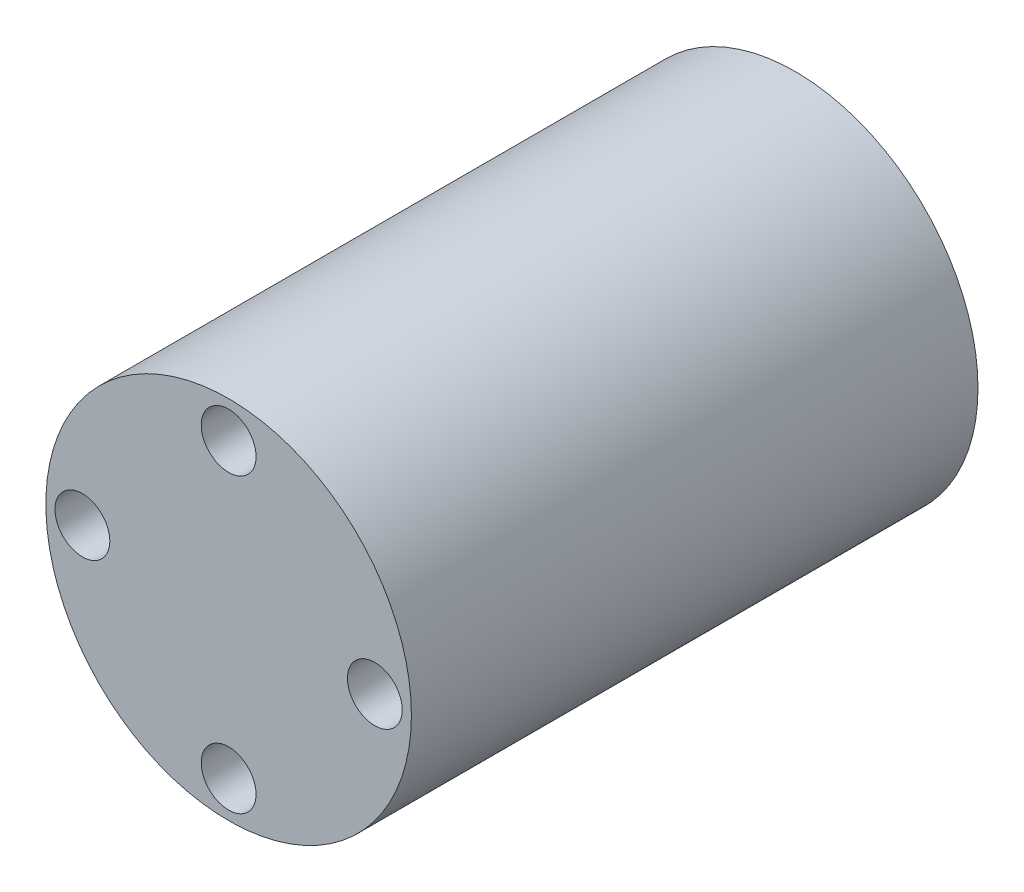
ISO-10303-21;
HEADER;
FILE_DESCRIPTION(('STEP AP214'),'2;1');
FILE_NAME('part.step','',(''),(''),'','','');
FILE_SCHEMA(('AUTOMOTIVE_DESIGN { 1 0 10303 214 1 1 1 1 }'));
ENDSEC;
DATA;
#1=APPLICATION_CONTEXT('core data for automotive mechanical design processes');
#2=APPLICATION_PROTOCOL_DEFINITION('international standard','automotive_design',2000,#1);
#3=PRODUCT_CONTEXT('',#1,'mechanical');
#4=PRODUCT('Part','Part','',(#3));
#5=PRODUCT_RELATED_PRODUCT_CATEGORY('part','',(#4));
#6=PRODUCT_DEFINITION_FORMATION('','',#4);
#7=PRODUCT_DEFINITION_CONTEXT('part definition',#1,'design');
#8=PRODUCT_DEFINITION('design','',#6,#7);
#9=PRODUCT_DEFINITION_SHAPE('','',#8);
#10=(LENGTH_UNIT() NAMED_UNIT(*) SI_UNIT(.MILLI.,.METRE.));
#11=(NAMED_UNIT(*) PLANE_ANGLE_UNIT() SI_UNIT($,.RADIAN.));
#12=(NAMED_UNIT(*) SI_UNIT($,.STERADIAN.) SOLID_ANGLE_UNIT());
#13=UNCERTAINTY_MEASURE_WITH_UNIT(LENGTH_MEASURE(1.E-05),#10,'distance_accuracy_value','');
#14=(GEOMETRIC_REPRESENTATION_CONTEXT(3) GLOBAL_UNCERTAINTY_ASSIGNED_CONTEXT((#13)) GLOBAL_UNIT_ASSIGNED_CONTEXT((#10,
#11,#12)) REPRESENTATION_CONTEXT('',''));
#15=CARTESIAN_POINT('',(0.,0.,0.));
#16=DIRECTION('',(0.,0.,1.));
#17=DIRECTION('',(1.,0.,0.));
#18=AXIS2_PLACEMENT_3D('',#15,#16,#17);
#19=CARTESIAN_POINT('',(0.,8.,31.));
#20=DIRECTION('',(0.,0.,-1.));
#21=DIRECTION('',(-1.,0.,0.));
#22=AXIS2_PLACEMENT_3D('',#19,#20,#21);
#23=CYLINDRICAL_SURFACE('',#22,1.5);
#24=CARTESIAN_POINT('',(0.,8.,31.));
#25=DIRECTION('',(0.,0.,1.));
#26=DIRECTION('',(1.,0.,0.));
#27=AXIS2_PLACEMENT_3D('',#24,#25,#26);
#28=CIRCLE('',#27,1.5);
#29=CARTESIAN_POINT('',(1.50000000000008,8.,31.));
#30=VERTEX_POINT('',#29);
#31=EDGE_CURVE('E47',#30,#30,#28,.T.);
#32=ORIENTED_EDGE('',*,*,#31,.T.);
#33=EDGE_LOOP('',(#32));
#34=FACE_BOUND('',#33,.T.);
#35=CARTESIAN_POINT('',(0.,8.,0.));
#36=DIRECTION('',(0.,0.,1.));
#37=DIRECTION('',(1.,0.,0.));
#38=AXIS2_PLACEMENT_3D('',#35,#36,#37);
#39=CIRCLE('',#38,1.5);
#40=CARTESIAN_POINT('',(1.50000000000008,8.,0.));
#41=VERTEX_POINT('',#40);
#42=EDGE_CURVE('E64',#41,#41,#39,.T.);
#43=ORIENTED_EDGE('',*,*,#42,.F.);
#44=EDGE_LOOP('',(#43));
#45=FACE_BOUND('',#44,.T.);
#46=ADVANCED_FACE('F39',(#34,#45),#23,.F.);
#47=CARTESIAN_POINT('',(-8.,0.,31.));
#48=DIRECTION('',(0.,0.,-1.));
#49=DIRECTION('',(-1.,0.,0.));
#50=AXIS2_PLACEMENT_3D('',#47,#48,#49);
#51=CYLINDRICAL_SURFACE('',#50,1.5);
#52=CARTESIAN_POINT('',(-8.,0.,31.));
#53=DIRECTION('',(0.,0.,1.));
#54=DIRECTION('',(1.,0.,0.));
#55=AXIS2_PLACEMENT_3D('',#52,#53,#54);
#56=CIRCLE('',#55,1.5);
#57=CARTESIAN_POINT('',(-6.5,0.,31.));
#58=VERTEX_POINT('',#57);
#59=EDGE_CURVE('E52',#58,#58,#56,.T.);
#60=ORIENTED_EDGE('',*,*,#59,.T.);
#61=EDGE_LOOP('',(#60));
#62=FACE_BOUND('',#61,.T.);
#63=CARTESIAN_POINT('',(-8.,0.,0.));
#64=DIRECTION('',(0.,0.,1.));
#65=DIRECTION('',(1.,0.,0.));
#66=AXIS2_PLACEMENT_3D('',#63,#64,#65);
#67=CIRCLE('',#66,1.5);
#68=CARTESIAN_POINT('',(-6.5,0.,0.));
#69=VERTEX_POINT('',#68);
#70=EDGE_CURVE('E62',#69,#69,#67,.T.);
#71=ORIENTED_EDGE('',*,*,#70,.F.);
#72=EDGE_LOOP('',(#71));
#73=FACE_BOUND('',#72,.T.);
#74=ADVANCED_FACE('F82',(#62,#73),#51,.F.);
#75=CARTESIAN_POINT('',(0.,-8.,31.));
#76=DIRECTION('',(0.,0.,-1.));
#77=DIRECTION('',(-1.,0.,0.));
#78=AXIS2_PLACEMENT_3D('',#75,#76,#77);
#79=CYLINDRICAL_SURFACE('',#78,1.5);
#80=CARTESIAN_POINT('',(0.,-8.,31.));
#81=DIRECTION('',(0.,0.,1.));
#82=DIRECTION('',(1.,0.,0.));
#83=AXIS2_PLACEMENT_3D('',#80,#81,#82);
#84=CIRCLE('',#83,1.5);
#85=CARTESIAN_POINT('',(1.49999999999997,-8.,31.));
#86=VERTEX_POINT('',#85);
#87=EDGE_CURVE('E73',#86,#86,#84,.T.);
#88=ORIENTED_EDGE('',*,*,#87,.T.);
#89=EDGE_LOOP('',(#88));
#90=FACE_BOUND('',#89,.T.);
#91=CARTESIAN_POINT('',(0.,-8.,0.));
#92=DIRECTION('',(0.,0.,1.));
#93=DIRECTION('',(1.,0.,0.));
#94=AXIS2_PLACEMENT_3D('',#91,#92,#93);
#95=CIRCLE('',#94,1.5);
#96=CARTESIAN_POINT('',(1.49999999999997,-8.,0.));
#97=VERTEX_POINT('',#96);
#98=EDGE_CURVE('E59',#97,#97,#95,.T.);
#99=ORIENTED_EDGE('',*,*,#98,.F.);
#100=EDGE_LOOP('',(#99));
#101=FACE_BOUND('',#100,.T.);
#102=ADVANCED_FACE('F100',(#90,#101),#79,.F.);
#103=CARTESIAN_POINT('',(8.,0.,31.));
#104=DIRECTION('',(0.,0.,-1.));
#105=DIRECTION('',(-1.,0.,0.));
#106=AXIS2_PLACEMENT_3D('',#103,#104,#105);
#107=CYLINDRICAL_SURFACE('',#106,1.5);
#108=CARTESIAN_POINT('',(8.,0.,31.));
#109=DIRECTION('',(0.,0.,1.));
#110=DIRECTION('',(1.,0.,0.));
#111=AXIS2_PLACEMENT_3D('',#108,#109,#110);
#112=CIRCLE('',#111,1.5);
#113=CARTESIAN_POINT('',(9.5,0.,31.));
#114=VERTEX_POINT('',#113);
#115=EDGE_CURVE('E69',#114,#114,#112,.T.);
#116=ORIENTED_EDGE('',*,*,#115,.T.);
#117=EDGE_LOOP('',(#116));
#118=FACE_BOUND('',#117,.T.);
#119=CARTESIAN_POINT('',(8.,0.,0.));
#120=DIRECTION('',(0.,0.,1.));
#121=DIRECTION('',(1.,0.,0.));
#122=AXIS2_PLACEMENT_3D('',#119,#120,#121);
#123=CIRCLE('',#122,1.5);
#124=CARTESIAN_POINT('',(9.5,0.,0.));
#125=VERTEX_POINT('',#124);
#126=EDGE_CURVE('E56',#125,#125,#123,.T.);
#127=ORIENTED_EDGE('',*,*,#126,.F.);
#128=EDGE_LOOP('',(#127));
#129=FACE_BOUND('',#128,.T.);
#130=ADVANCED_FACE('F41',(#118,#129),#107,.F.);
#131=CARTESIAN_POINT('',(0.,0.,31.));
#132=DIRECTION('',(0.,0.,-1.));
#133=DIRECTION('',(-1.,0.,0.));
#134=AXIS2_PLACEMENT_3D('',#131,#132,#133);
#135=CYLINDRICAL_SURFACE('',#134,10.);
#136=CARTESIAN_POINT('',(0.,0.,31.));
#137=DIRECTION('',(0.,0.,1.));
#138=DIRECTION('',(1.,0.,0.));
#139=AXIS2_PLACEMENT_3D('',#136,#137,#138);
#140=CIRCLE('',#139,10.);
#141=CARTESIAN_POINT('',(10.,0.,31.));
#142=VERTEX_POINT('',#141);
#143=EDGE_CURVE('E10',#142,#142,#140,.T.);
#144=ORIENTED_EDGE('',*,*,#143,.F.);
#145=EDGE_LOOP('',(#144));
#146=FACE_BOUND('',#145,.T.);
#147=CARTESIAN_POINT('',(0.,0.,0.));
#148=DIRECTION('',(0.,0.,1.));
#149=DIRECTION('',(1.,0.,0.));
#150=AXIS2_PLACEMENT_3D('',#147,#148,#149);
#151=CIRCLE('',#150,10.);
#152=CARTESIAN_POINT('',(10.,0.,0.));
#153=VERTEX_POINT('',#152);
#154=EDGE_CURVE('E43',#153,#153,#151,.T.);
#155=ORIENTED_EDGE('',*,*,#154,.T.);
#156=EDGE_LOOP('',(#155));
#157=FACE_BOUND('',#156,.T.);
#158=ADVANCED_FACE('F89',(#146,#157),#135,.T.);
#159=CARTESIAN_POINT('',(0.,0.,31.));
#160=DIRECTION('',(0.,0.,1.));
#161=DIRECTION('',(1.,0.,0.));
#162=AXIS2_PLACEMENT_3D('',#159,#160,#161);
#163=PLANE('',#162);
#164=ORIENTED_EDGE('',*,*,#115,.F.);
#165=EDGE_LOOP('',(#164));
#166=FACE_BOUND('',#165,.T.);
#167=ORIENTED_EDGE('',*,*,#87,.F.);
#168=EDGE_LOOP('',(#167));
#169=FACE_BOUND('',#168,.T.);
#170=ORIENTED_EDGE('',*,*,#59,.F.);
#171=EDGE_LOOP('',(#170));
#172=FACE_BOUND('',#171,.T.);
#173=ORIENTED_EDGE('',*,*,#31,.F.);
#174=EDGE_LOOP('',(#173));
#175=FACE_BOUND('',#174,.T.);
#176=ORIENTED_EDGE('',*,*,#143,.T.);
#177=EDGE_LOOP('',(#176));
#178=FACE_BOUND('',#177,.T.);
#179=ADVANCED_FACE('F85',(#166,#169,#172,#175,#178),#163,.T.);
#180=CARTESIAN_POINT('',(0.,0.,0.));
#181=DIRECTION('',(0.,0.,1.));
#182=DIRECTION('',(1.,0.,0.));
#183=AXIS2_PLACEMENT_3D('',#180,#181,#182);
#184=PLANE('',#183);
#185=ORIENTED_EDGE('',*,*,#126,.T.);
#186=EDGE_LOOP('',(#185));
#187=FACE_BOUND('',#186,.T.);
#188=ORIENTED_EDGE('',*,*,#98,.T.);
#189=EDGE_LOOP('',(#188));
#190=FACE_BOUND('',#189,.T.);
#191=ORIENTED_EDGE('',*,*,#70,.T.);
#192=EDGE_LOOP('',(#191));
#193=FACE_BOUND('',#192,.T.);
#194=ORIENTED_EDGE('',*,*,#42,.T.);
#195=EDGE_LOOP('',(#194));
#196=FACE_BOUND('',#195,.T.);
#197=ORIENTED_EDGE('',*,*,#154,.F.);
#198=EDGE_LOOP('',(#197));
#199=FACE_BOUND('',#198,.T.);
#200=ADVANCED_FACE('F88',(#187,#190,#193,#196,#199),#184,.F.);
#201=CLOSED_SHELL('',(#46,#74,#102,#130,#158,#179,#200));
#202=MANIFOLD_SOLID_BREP('B2',#201);
#203=ADVANCED_BREP_SHAPE_REPRESENTATION('',(#18,#202),#14);
#204=SHAPE_DEFINITION_REPRESENTATION(#9,#203);
ENDSEC;
END-ISO-10303-21;
